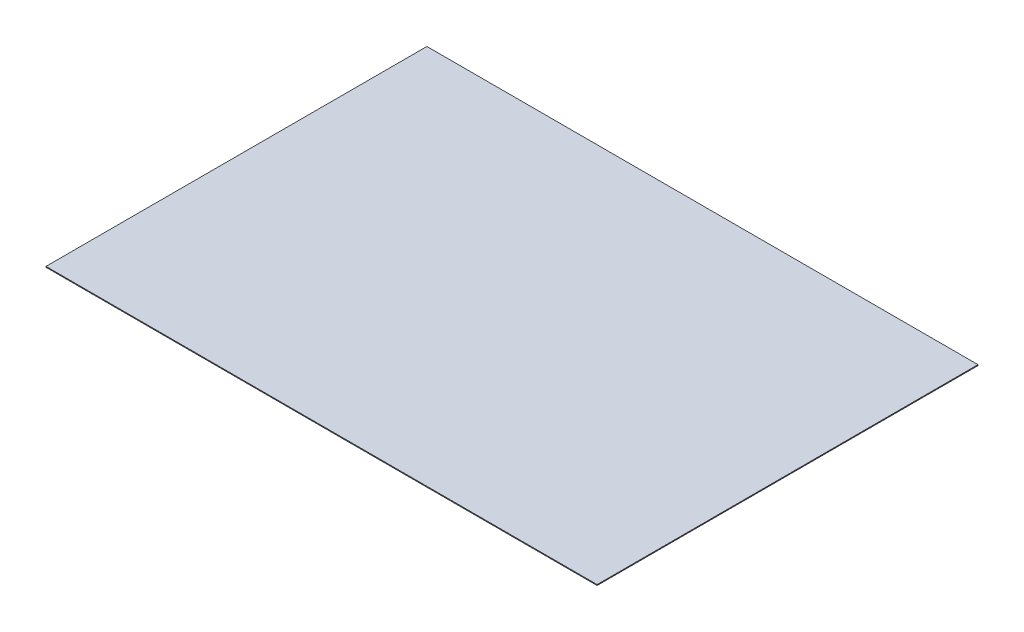
ISO-10303-21;
HEADER;
FILE_DESCRIPTION(('STEP AP214'),'2;1');
FILE_NAME('part.step','',(''),(''),'','','');
FILE_SCHEMA(('AUTOMOTIVE_DESIGN { 1 0 10303 214 1 1 1 1 }'));
ENDSEC;
DATA;
#1=APPLICATION_CONTEXT('core data for automotive mechanical design processes');
#2=APPLICATION_PROTOCOL_DEFINITION('international standard','automotive_design',2000,#1);
#3=PRODUCT_CONTEXT('',#1,'mechanical');
#4=PRODUCT('Part','Part','',(#3));
#5=PRODUCT_RELATED_PRODUCT_CATEGORY('part','',(#4));
#6=PRODUCT_DEFINITION_FORMATION('','',#4);
#7=PRODUCT_DEFINITION_CONTEXT('part definition',#1,'design');
#8=PRODUCT_DEFINITION('design','',#6,#7);
#9=PRODUCT_DEFINITION_SHAPE('','',#8);
#10=(LENGTH_UNIT() NAMED_UNIT(*) SI_UNIT(.MILLI.,.METRE.));
#11=(NAMED_UNIT(*) PLANE_ANGLE_UNIT() SI_UNIT($,.RADIAN.));
#12=(NAMED_UNIT(*) SI_UNIT($,.STERADIAN.) SOLID_ANGLE_UNIT());
#13=UNCERTAINTY_MEASURE_WITH_UNIT(LENGTH_MEASURE(1.E-05),#10,'distance_accuracy_value','');
#14=(GEOMETRIC_REPRESENTATION_CONTEXT(3) GLOBAL_UNCERTAINTY_ASSIGNED_CONTEXT((#13)) GLOBAL_UNIT_ASSIGNED_CONTEXT((#10,
#11,#12)) REPRESENTATION_CONTEXT('',''));
#15=CARTESIAN_POINT('',(0.,0.,0.));
#16=DIRECTION('',(0.,0.,1.));
#17=DIRECTION('',(1.,0.,0.));
#18=AXIS2_PLACEMENT_3D('',#15,#16,#17);
#19=CARTESIAN_POINT('',(-6475.,20.,4475.));
#20=DIRECTION('',(1.,0.,0.));
#21=DIRECTION('',(0.,0.,-1.));
#22=AXIS2_PLACEMENT_3D('',#19,#20,#21);
#23=PLANE('',#22);
#24=DIRECTION('',(0.,0.,1.));
#25=VECTOR('',#24,1.);
#26=CARTESIAN_POINT('',(-6475.,0.,4475.));
#27=LINE('',#26,#25);
#28=CARTESIAN_POINT('',(-6475.,0.,-4475.));
#29=VERTEX_POINT('',#28);
#30=CARTESIAN_POINT('',(-6475.,0.,4475.));
#31=VERTEX_POINT('',#30);
#32=EDGE_CURVE('E104',#29,#31,#27,.T.);
#33=ORIENTED_EDGE('',*,*,#32,.T.);
#34=DIRECTION('',(0.,-1.,0.));
#35=VECTOR('',#34,1.);
#36=CARTESIAN_POINT('',(-6475.,20.,4475.));
#37=LINE('',#36,#35);
#38=CARTESIAN_POINT('',(-6475.,20.,4475.));
#39=VERTEX_POINT('',#38);
#40=EDGE_CURVE('E11',#39,#31,#37,.T.);
#41=ORIENTED_EDGE('',*,*,#40,.F.);
#42=DIRECTION('',(0.,0.,1.));
#43=VECTOR('',#42,1.);
#44=CARTESIAN_POINT('',(-6475.,20.,4475.));
#45=LINE('',#44,#43);
#46=CARTESIAN_POINT('',(-6475.,20.,-4475.));
#47=VERTEX_POINT('',#46);
#48=EDGE_CURVE('E92',#47,#39,#45,.T.);
#49=ORIENTED_EDGE('',*,*,#48,.F.);
#50=DIRECTION('',(0.,-1.,0.));
#51=VECTOR('',#50,1.);
#52=CARTESIAN_POINT('',(-6475.,20.,-4475.));
#53=LINE('',#52,#51);
#54=EDGE_CURVE('E100',#47,#29,#53,.T.);
#55=ORIENTED_EDGE('',*,*,#54,.T.);
#56=EDGE_LOOP('',(#33,#41,#49,#55));
#57=FACE_BOUND('',#56,.T.);
#58=ADVANCED_FACE('F41',(#57),#23,.F.);
#59=CARTESIAN_POINT('',(6475.,20.,4475.));
#60=DIRECTION('',(0.,0.,-1.));
#61=DIRECTION('',(-1.,0.,0.));
#62=AXIS2_PLACEMENT_3D('',#59,#60,#61);
#63=PLANE('',#62);
#64=DIRECTION('',(1.,0.,0.));
#65=VECTOR('',#64,1.);
#66=CARTESIAN_POINT('',(6475.,0.,4475.));
#67=LINE('',#66,#65);
#68=CARTESIAN_POINT('',(6475.,0.,4475.));
#69=VERTEX_POINT('',#68);
#70=EDGE_CURVE('E96',#31,#69,#67,.T.);
#71=ORIENTED_EDGE('',*,*,#70,.T.);
#72=DIRECTION('',(0.,-1.,0.));
#73=VECTOR('',#72,1.);
#74=CARTESIAN_POINT('',(6475.,20.,4475.));
#75=LINE('',#74,#73);
#76=CARTESIAN_POINT('',(6475.,20.,4475.));
#77=VERTEX_POINT('',#76);
#78=EDGE_CURVE('E49',#77,#69,#75,.T.);
#79=ORIENTED_EDGE('',*,*,#78,.F.);
#80=DIRECTION('',(1.,0.,0.));
#81=VECTOR('',#80,1.);
#82=CARTESIAN_POINT('',(6475.,20.,4475.));
#83=LINE('',#82,#81);
#84=EDGE_CURVE('E87',#39,#77,#83,.T.);
#85=ORIENTED_EDGE('',*,*,#84,.F.);
#86=ORIENTED_EDGE('',*,*,#40,.T.);
#87=EDGE_LOOP('',(#71,#79,#85,#86));
#88=FACE_BOUND('',#87,.T.);
#89=ADVANCED_FACE('F95',(#88),#63,.F.);
#90=CARTESIAN_POINT('',(6475.,20.,4475.));
#91=DIRECTION('',(-1.,0.,0.));
#92=DIRECTION('',(0.,0.,1.));
#93=AXIS2_PLACEMENT_3D('',#90,#91,#92);
#94=PLANE('',#93);
#95=DIRECTION('',(0.,0.,-1.));
#96=VECTOR('',#95,1.);
#97=CARTESIAN_POINT('',(6475.,0.,4475.));
#98=LINE('',#97,#96);
#99=CARTESIAN_POINT('',(6475.,0.,-4475.));
#100=VERTEX_POINT('',#99);
#101=EDGE_CURVE('E74',#69,#100,#98,.T.);
#102=ORIENTED_EDGE('',*,*,#101,.T.);
#103=DIRECTION('',(0.,-1.,0.));
#104=VECTOR('',#103,1.);
#105=CARTESIAN_POINT('',(6475.,20.,-4475.));
#106=LINE('',#105,#104);
#107=CARTESIAN_POINT('',(6475.,20.,-4475.));
#108=VERTEX_POINT('',#107);
#109=EDGE_CURVE('E97',#108,#100,#106,.T.);
#110=ORIENTED_EDGE('',*,*,#109,.F.);
#111=DIRECTION('',(0.,0.,-1.));
#112=VECTOR('',#111,1.);
#113=CARTESIAN_POINT('',(6475.,20.,4475.));
#114=LINE('',#113,#112);
#115=EDGE_CURVE('E90',#77,#108,#114,.T.);
#116=ORIENTED_EDGE('',*,*,#115,.F.);
#117=ORIENTED_EDGE('',*,*,#78,.T.);
#118=EDGE_LOOP('',(#102,#110,#116,#117));
#119=FACE_BOUND('',#118,.T.);
#120=ADVANCED_FACE('F98',(#119),#94,.F.);
#121=CARTESIAN_POINT('',(6475.,20.,-4475.));
#122=DIRECTION('',(0.,0.,1.));
#123=DIRECTION('',(1.,0.,0.));
#124=AXIS2_PLACEMENT_3D('',#121,#122,#123);
#125=PLANE('',#124);
#126=DIRECTION('',(-1.,0.,0.));
#127=VECTOR('',#126,1.);
#128=CARTESIAN_POINT('',(6475.,0.,-4475.));
#129=LINE('',#128,#127);
#130=EDGE_CURVE('E80',#100,#29,#129,.T.);
#131=ORIENTED_EDGE('',*,*,#130,.T.);
#132=ORIENTED_EDGE('',*,*,#54,.F.);
#133=DIRECTION('',(-1.,0.,0.));
#134=VECTOR('',#133,1.);
#135=CARTESIAN_POINT('',(6475.,20.,-4475.));
#136=LINE('',#135,#134);
#137=EDGE_CURVE('E57',#108,#47,#136,.T.);
#138=ORIENTED_EDGE('',*,*,#137,.F.);
#139=ORIENTED_EDGE('',*,*,#109,.T.);
#140=EDGE_LOOP('',(#131,#132,#138,#139));
#141=FACE_BOUND('',#140,.T.);
#142=ADVANCED_FACE('F111',(#141),#125,.F.);
#143=CARTESIAN_POINT('',(-6475.,20.,-4475.));
#144=DIRECTION('',(0.,1.,0.));
#145=DIRECTION('',(0.,0.,1.));
#146=AXIS2_PLACEMENT_3D('',#143,#144,#145);
#147=PLANE('',#146);
#148=ORIENTED_EDGE('',*,*,#48,.T.);
#149=ORIENTED_EDGE('',*,*,#84,.T.);
#150=ORIENTED_EDGE('',*,*,#115,.T.);
#151=ORIENTED_EDGE('',*,*,#137,.T.);
#152=EDGE_LOOP('',(#148,#149,#150,#151));
#153=FACE_BOUND('',#152,.T.);
#154=ADVANCED_FACE('F88',(#153),#147,.T.);
#155=CARTESIAN_POINT('',(-6475.,0.,-4475.));
#156=DIRECTION('',(0.,1.,0.));
#157=DIRECTION('',(0.,0.,1.));
#158=AXIS2_PLACEMENT_3D('',#155,#156,#157);
#159=PLANE('',#158);
#160=ORIENTED_EDGE('',*,*,#32,.F.);
#161=ORIENTED_EDGE('',*,*,#130,.F.);
#162=ORIENTED_EDGE('',*,*,#101,.F.);
#163=ORIENTED_EDGE('',*,*,#70,.F.);
#164=EDGE_LOOP('',(#160,#161,#162,#163));
#165=FACE_BOUND('',#164,.T.);
#166=ADVANCED_FACE('F114',(#165),#159,.F.);
#167=CLOSED_SHELL('',(#58,#89,#120,#142,#154,#166));
#168=MANIFOLD_SOLID_BREP('B2',#167);
#169=ADVANCED_BREP_SHAPE_REPRESENTATION('',(#18,#168),#14);
#170=SHAPE_DEFINITION_REPRESENTATION(#9,#169);
ENDSEC;
END-ISO-10303-21;
